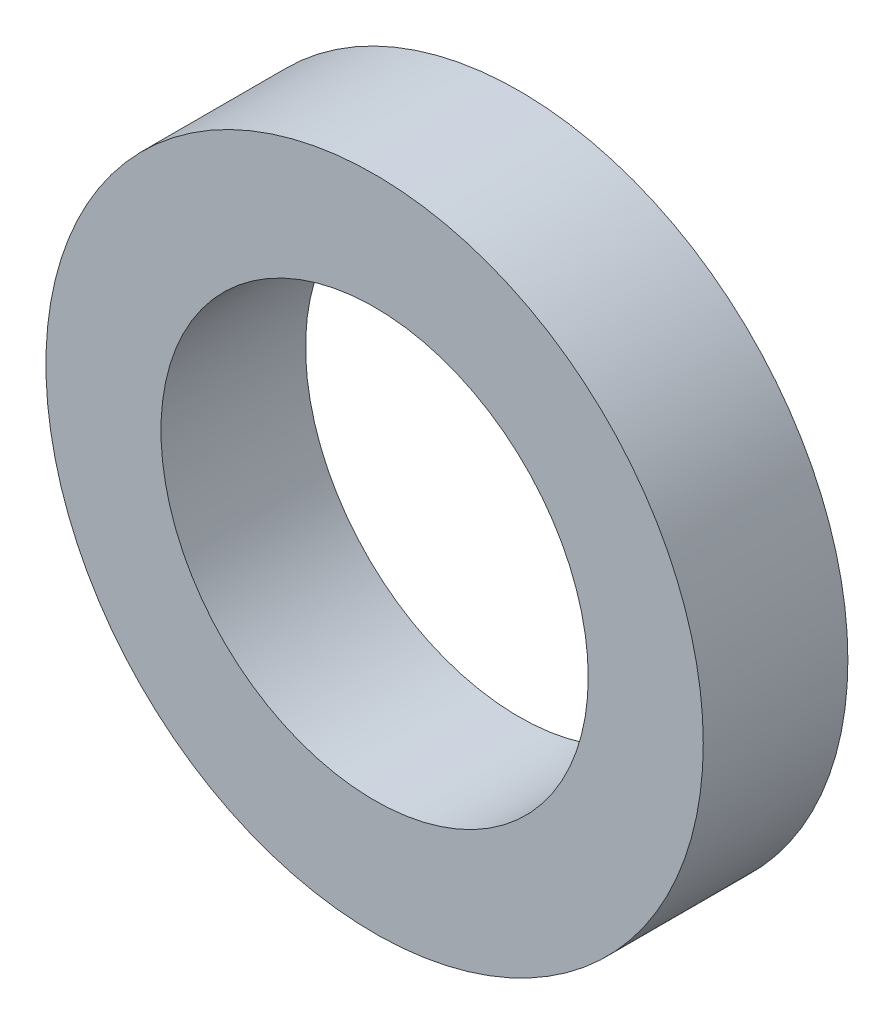
ISO-10303-21;
HEADER;
FILE_DESCRIPTION(('STEP AP214'),'2;1');
FILE_NAME('part.step','',(''),(''),'','','');
FILE_SCHEMA(('AUTOMOTIVE_DESIGN { 1 0 10303 214 1 1 1 1 }'));
ENDSEC;
DATA;
#1=APPLICATION_CONTEXT('core data for automotive mechanical design processes');
#2=APPLICATION_PROTOCOL_DEFINITION('international standard','automotive_design',2000,#1);
#3=PRODUCT_CONTEXT('',#1,'mechanical');
#4=PRODUCT('Part','Part','',(#3));
#5=PRODUCT_RELATED_PRODUCT_CATEGORY('part','',(#4));
#6=PRODUCT_DEFINITION_FORMATION('','',#4);
#7=PRODUCT_DEFINITION_CONTEXT('part definition',#1,'design');
#8=PRODUCT_DEFINITION('design','',#6,#7);
#9=PRODUCT_DEFINITION_SHAPE('','',#8);
#10=(LENGTH_UNIT() NAMED_UNIT(*) SI_UNIT(.MILLI.,.METRE.));
#11=(NAMED_UNIT(*) PLANE_ANGLE_UNIT() SI_UNIT($,.RADIAN.));
#12=(NAMED_UNIT(*) SI_UNIT($,.STERADIAN.) SOLID_ANGLE_UNIT());
#13=UNCERTAINTY_MEASURE_WITH_UNIT(LENGTH_MEASURE(1.E-05),#10,'distance_accuracy_value','');
#14=(GEOMETRIC_REPRESENTATION_CONTEXT(3) GLOBAL_UNCERTAINTY_ASSIGNED_CONTEXT((#13)) GLOBAL_UNIT_ASSIGNED_CONTEXT((#10,
#11,#12)) REPRESENTATION_CONTEXT('',''));
#15=CARTESIAN_POINT('',(0.,0.,0.));
#16=DIRECTION('',(0.,0.,1.));
#17=DIRECTION('',(1.,0.,0.));
#18=AXIS2_PLACEMENT_3D('',#15,#16,#17);
#19=CARTESIAN_POINT('',(0.,0.,2.2));
#20=DIRECTION('',(0.,0.,1.));
#21=DIRECTION('',(1.,0.,0.));
#22=AXIS2_PLACEMENT_3D('',#19,#20,#21);
#23=PLANE('',#22);
#24=CARTESIAN_POINT('',(0.,0.,2.2));
#25=DIRECTION('',(0.,0.,1.));
#26=DIRECTION('',(1.,0.,0.));
#27=AXIS2_PLACEMENT_3D('',#24,#25,#26);
#28=CIRCLE('',#27,5.);
#29=CARTESIAN_POINT('',(5.,0.,2.2));
#30=VERTEX_POINT('',#29);
#31=EDGE_CURVE('E10',#30,#30,#28,.T.);
#32=ORIENTED_EDGE('',*,*,#31,.T.);
#33=EDGE_LOOP('',(#32));
#34=FACE_BOUND('',#33,.T.);
#35=CARTESIAN_POINT('',(0.,0.,2.2));
#36=DIRECTION('',(0.,0.,1.));
#37=DIRECTION('',(1.,0.,0.));
#38=AXIS2_PLACEMENT_3D('',#35,#36,#37);
#39=CIRCLE('',#38,3.25);
#40=CARTESIAN_POINT('',(3.25,0.,2.2));
#41=VERTEX_POINT('',#40);
#42=EDGE_CURVE('E58',#41,#41,#39,.T.);
#43=ORIENTED_EDGE('',*,*,#42,.F.);
#44=EDGE_LOOP('',(#43));
#45=FACE_BOUND('',#44,.T.);
#46=ADVANCED_FACE('F43',(#34,#45),#23,.T.);
#47=CARTESIAN_POINT('',(0.,0.,0.));
#48=DIRECTION('',(0.,0.,1.));
#49=DIRECTION('',(1.,0.,0.));
#50=AXIS2_PLACEMENT_3D('',#47,#48,#49);
#51=PLANE('',#50);
#52=CARTESIAN_POINT('',(0.,0.,0.));
#53=DIRECTION('',(0.,0.,1.));
#54=DIRECTION('',(1.,0.,0.));
#55=AXIS2_PLACEMENT_3D('',#52,#53,#54);
#56=CIRCLE('',#55,5.);
#57=CARTESIAN_POINT('',(5.,0.,0.));
#58=VERTEX_POINT('',#57);
#59=EDGE_CURVE('E47',#58,#58,#56,.T.);
#60=ORIENTED_EDGE('',*,*,#59,.F.);
#61=EDGE_LOOP('',(#60));
#62=FACE_BOUND('',#61,.T.);
#63=CARTESIAN_POINT('',(0.,0.,0.));
#64=DIRECTION('',(0.,0.,1.));
#65=DIRECTION('',(1.,0.,0.));
#66=AXIS2_PLACEMENT_3D('',#63,#64,#65);
#67=CIRCLE('',#66,3.25);
#68=CARTESIAN_POINT('',(3.25,0.,0.));
#69=VERTEX_POINT('',#68);
#70=EDGE_CURVE('E60',#69,#69,#67,.T.);
#71=ORIENTED_EDGE('',*,*,#70,.T.);
#72=EDGE_LOOP('',(#71));
#73=FACE_BOUND('',#72,.T.);
#74=ADVANCED_FACE('F74',(#62,#73),#51,.F.);
#75=CARTESIAN_POINT('',(0.,0.,2.2));
#76=DIRECTION('',(0.,0.,-1.));
#77=DIRECTION('',(-1.,0.,0.));
#78=AXIS2_PLACEMENT_3D('',#75,#76,#77);
#79=CYLINDRICAL_SURFACE('',#78,5.);
#80=ORIENTED_EDGE('',*,*,#31,.F.);
#81=EDGE_LOOP('',(#80));
#82=FACE_BOUND('',#81,.T.);
#83=ORIENTED_EDGE('',*,*,#59,.T.);
#84=EDGE_LOOP('',(#83));
#85=FACE_BOUND('',#84,.T.);
#86=ADVANCED_FACE('F45',(#82,#85),#79,.T.);
#87=CARTESIAN_POINT('',(0.,0.,2.2));
#88=DIRECTION('',(0.,0.,-1.));
#89=DIRECTION('',(-1.,0.,0.));
#90=AXIS2_PLACEMENT_3D('',#87,#88,#89);
#91=CYLINDRICAL_SURFACE('',#90,3.25);
#92=ORIENTED_EDGE('',*,*,#42,.T.);
#93=EDGE_LOOP('',(#92));
#94=FACE_BOUND('',#93,.T.);
#95=ORIENTED_EDGE('',*,*,#70,.F.);
#96=EDGE_LOOP('',(#95));
#97=FACE_BOUND('',#96,.T.);
#98=ADVANCED_FACE('F70',(#94,#97),#91,.F.);
#99=CLOSED_SHELL('',(#46,#74,#86,#98));
#100=MANIFOLD_SOLID_BREP('B2',#99);
#101=ADVANCED_BREP_SHAPE_REPRESENTATION('',(#18,#100),#14);
#102=SHAPE_DEFINITION_REPRESENTATION(#9,#101);
ENDSEC;
END-ISO-10303-21;
